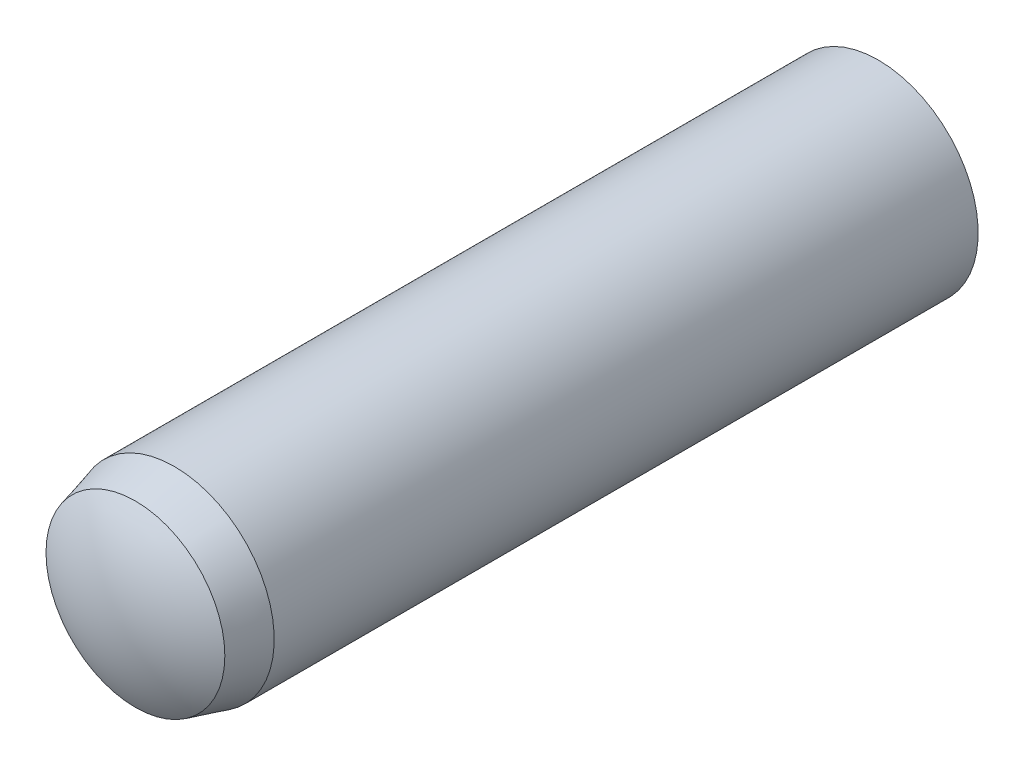
ISO-10303-21;
HEADER;
FILE_DESCRIPTION(('STEP AP214'),'2;1');
FILE_NAME('part.step','',(''),(''),'','','');
FILE_SCHEMA(('AUTOMOTIVE_DESIGN { 1 0 10303 214 1 1 1 1 }'));
ENDSEC;
DATA;
#1=APPLICATION_CONTEXT('core data for automotive mechanical design processes');
#2=APPLICATION_PROTOCOL_DEFINITION('international standard','automotive_design',2000,#1);
#3=PRODUCT_CONTEXT('',#1,'mechanical');
#4=PRODUCT('Part','Part','',(#3));
#5=PRODUCT_RELATED_PRODUCT_CATEGORY('part','',(#4));
#6=PRODUCT_DEFINITION_FORMATION('','',#4);
#7=PRODUCT_DEFINITION_CONTEXT('part definition',#1,'design');
#8=PRODUCT_DEFINITION('design','',#6,#7);
#9=PRODUCT_DEFINITION_SHAPE('','',#8);
#10=(LENGTH_UNIT() NAMED_UNIT(*) SI_UNIT(.MILLI.,.METRE.));
#11=(NAMED_UNIT(*) PLANE_ANGLE_UNIT() SI_UNIT($,.RADIAN.));
#12=(NAMED_UNIT(*) SI_UNIT($,.STERADIAN.) SOLID_ANGLE_UNIT());
#13=UNCERTAINTY_MEASURE_WITH_UNIT(LENGTH_MEASURE(1.E-05),#10,'distance_accuracy_value','');
#14=(GEOMETRIC_REPRESENTATION_CONTEXT(3) GLOBAL_UNCERTAINTY_ASSIGNED_CONTEXT((#13)) GLOBAL_UNIT_ASSIGNED_CONTEXT((#10,
#11,#12)) REPRESENTATION_CONTEXT('',''));
#15=CARTESIAN_POINT('',(0.,0.,0.));
#16=DIRECTION('',(0.,0.,1.));
#17=DIRECTION('',(1.,0.,0.));
#18=AXIS2_PLACEMENT_3D('',#15,#16,#17);
#19=CARTESIAN_POINT('',(0.,0.,-10.9166666666667));
#20=DIRECTION('',(0.,0.,1.));
#21=DIRECTION('',(0.,-1.,0.));
#22=AXIS2_PLACEMENT_3D('',#19,#20,#21);
#23=SPHERICAL_SURFACE('',#22,9.08333333333326);
#24=CARTESIAN_POINT('',(0.,0.,-18.5));
#25=DIRECTION('',(0.,0.,1.));
#26=DIRECTION('',(0.,-1.,0.));
#27=AXIS2_PLACEMENT_3D('',#24,#25,#26);
#28=CIRCLE('',#27,4.99999999999999);
#29=CARTESIAN_POINT('',(0.,-4.99999999999999,-18.5));
#30=VERTEX_POINT('',#29);
#31=EDGE_CURVE('E10',#30,#30,#28,.T.);
#32=ORIENTED_EDGE('',*,*,#31,.F.);
#33=EDGE_LOOP('',(#32));
#34=FACE_BOUND('',#33,.T.);
#35=ADVANCED_FACE('F35',(#34),#23,.T.);
#36=CARTESIAN_POINT('',(0.,0.,20.));
#37=DIRECTION('',(0.,0.,1.));
#38=DIRECTION('',(0.,-1.,0.));
#39=AXIS2_PLACEMENT_3D('',#36,#37,#38);
#40=CYLINDRICAL_SURFACE('',#39,4.99999999999999);
#41=CARTESIAN_POINT('',(0.,0.,16.75));
#42=DIRECTION('',(0.,0.,1.));
#43=DIRECTION('',(0.,-1.,0.));
#44=AXIS2_PLACEMENT_3D('',#41,#42,#43);
#45=CIRCLE('',#44,5.);
#46=CARTESIAN_POINT('',(0.,-5.,16.75));
#47=VERTEX_POINT('',#46);
#48=EDGE_CURVE('E41',#47,#47,#45,.T.);
#49=ORIENTED_EDGE('',*,*,#48,.F.);
#50=EDGE_LOOP('',(#49));
#51=FACE_BOUND('',#50,.T.);
#52=ORIENTED_EDGE('',*,*,#31,.T.);
#53=EDGE_LOOP('',(#52));
#54=FACE_BOUND('',#53,.T.);
#55=ADVANCED_FACE('F56',(#51,#54),#40,.T.);
#56=CARTESIAN_POINT('',(0.,0.,16.75));
#57=DIRECTION('',(0.,0.,-1.));
#58=DIRECTION('',(0.,1.,0.));
#59=AXIS2_PLACEMENT_3D('',#56,#57,#58);
#60=CONICAL_SURFACE('',#59,5.,0.26179938779915);
#61=CARTESIAN_POINT('',(0.,0.,18.7));
#62=DIRECTION('',(0.,0.,1.));
#63=DIRECTION('',(0.,-1.,0.));
#64=AXIS2_PLACEMENT_3D('',#61,#62,#63);
#65=CIRCLE('',#64,4.47749907475931);
#66=CARTESIAN_POINT('',(0.,-4.47749907475931,18.7));
#67=VERTEX_POINT('',#66);
#68=EDGE_CURVE('E45',#67,#67,#65,.T.);
#69=ORIENTED_EDGE('',*,*,#68,.F.);
#70=EDGE_LOOP('',(#69));
#71=FACE_BOUND('',#70,.T.);
#72=ORIENTED_EDGE('',*,*,#48,.T.);
#73=EDGE_LOOP('',(#72));
#74=FACE_BOUND('',#73,.T.);
#75=ADVANCED_FACE('F54',(#71,#74),#60,.T.);
#76=CARTESIAN_POINT('',(0.,0.,11.6392315521268));
#77=DIRECTION('',(0.,0.,1.));
#78=DIRECTION('',(0.,1.,0.));
#79=AXIS2_PLACEMENT_3D('',#76,#77,#78);
#80=SPHERICAL_SURFACE('',#79,8.36076844787324);
#81=ORIENTED_EDGE('',*,*,#68,.T.);
#82=EDGE_LOOP('',(#81));
#83=FACE_BOUND('',#82,.T.);
#84=ADVANCED_FACE('F52',(#83),#80,.T.);
#85=CLOSED_SHELL('',(#35,#55,#75,#84));
#86=MANIFOLD_SOLID_BREP('B2',#85);
#87=ADVANCED_BREP_SHAPE_REPRESENTATION('',(#18,#86),#14);
#88=SHAPE_DEFINITION_REPRESENTATION(#9,#87);
ENDSEC;
END-ISO-10303-21;
